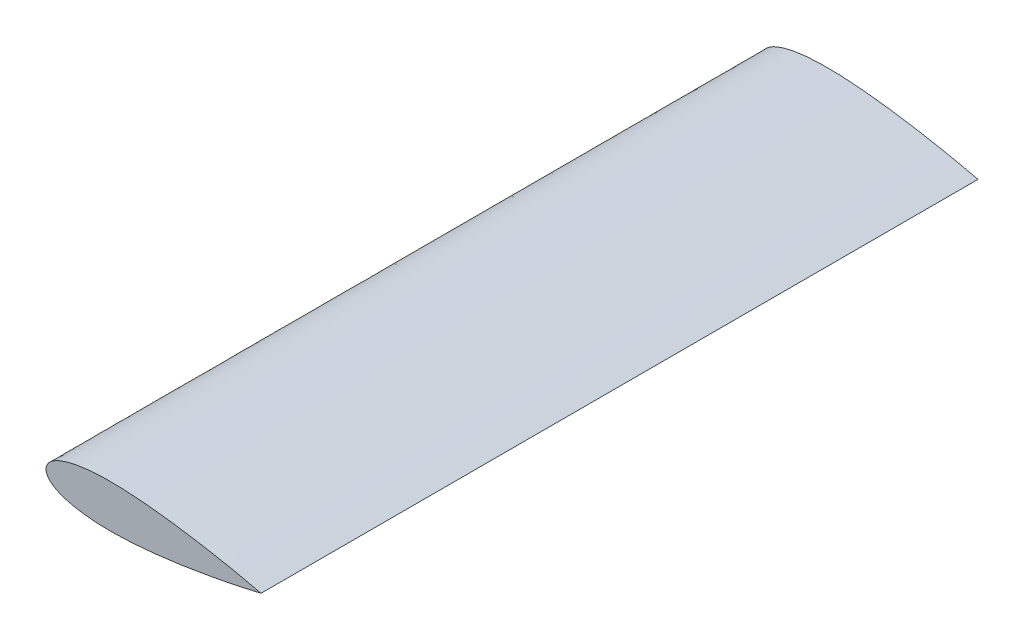
ISO-10303-21;
HEADER;
FILE_DESCRIPTION(('STEP AP214'),'2;1');
FILE_NAME('part.step','',(''),(''),'','','');
FILE_SCHEMA(('AUTOMOTIVE_DESIGN { 1 0 10303 214 1 1 1 1 }'));
ENDSEC;
DATA;
#1=APPLICATION_CONTEXT('core data for automotive mechanical design processes');
#2=APPLICATION_PROTOCOL_DEFINITION('international standard','automotive_design',2000,#1);
#3=PRODUCT_CONTEXT('',#1,'mechanical');
#4=PRODUCT('Part','Part','',(#3));
#5=PRODUCT_RELATED_PRODUCT_CATEGORY('part','',(#4));
#6=PRODUCT_DEFINITION_FORMATION('','',#4);
#7=PRODUCT_DEFINITION_CONTEXT('part definition',#1,'design');
#8=PRODUCT_DEFINITION('design','',#6,#7);
#9=PRODUCT_DEFINITION_SHAPE('','',#8);
#10=(LENGTH_UNIT() NAMED_UNIT(*) SI_UNIT(.MILLI.,.METRE.));
#11=(NAMED_UNIT(*) PLANE_ANGLE_UNIT() SI_UNIT($,.RADIAN.));
#12=(NAMED_UNIT(*) SI_UNIT($,.STERADIAN.) SOLID_ANGLE_UNIT());
#13=UNCERTAINTY_MEASURE_WITH_UNIT(LENGTH_MEASURE(1.E-05),#10,'distance_accuracy_value','');
#14=(GEOMETRIC_REPRESENTATION_CONTEXT(3) GLOBAL_UNCERTAINTY_ASSIGNED_CONTEXT((#13)) GLOBAL_UNIT_ASSIGNED_CONTEXT((#10,
#11,#12)) REPRESENTATION_CONTEXT('',''));
#15=CARTESIAN_POINT('',(0.,0.,0.));
#16=DIRECTION('',(0.,0.,1.));
#17=DIRECTION('',(1.,0.,0.));
#18=AXIS2_PLACEMENT_3D('',#15,#16,#17);
#19=CARTESIAN_POINT('',(0.,0.,1000.));
#20=CARTESIAN_POINT('',(-0.000212290200710549,-0.506970743672854,1000.));
#21=CARTESIAN_POINT('',(0.0448647544289061,-1.3817144126552,1000.));
#22=CARTESIAN_POINT('',(0.226017079419716,-2.65083947509055,1000.));
#23=CARTESIAN_POINT('',(0.688025343513839,-4.29995255231681,1000.));
#24=CARTESIAN_POINT('',(1.33554630451256,-5.87304167521856,1000.));
#25=CARTESIAN_POINT('',(2.26695445030294,-7.54257918905263,1000.));
#26=CARTESIAN_POINT('',(3.57194696369109,-9.34610957166791,1000.));
#27=CARTESIAN_POINT('',(5.39138181461839,-11.3246739377115,1000.));
#28=CARTESIAN_POINT('',(7.95446974302064,-13.539518756678,1000.));
#29=CARTESIAN_POINT('',(11.5849756721098,-16.0215104117936,1000.));
#30=CARTESIAN_POINT('',(16.648123965691,-18.72698856863,1000.));
#31=CARTESIAN_POINT('',(23.7931899992348,-21.6497814350951,1000.));
#32=CARTESIAN_POINT('',(33.085765079101,-24.436937203148,1000.));
#33=CARTESIAN_POINT('',(46.6430589076313,-27.2844937854531,1000.));
#34=CARTESIAN_POINT('',(64.0631993073416,-29.3626934954131,1000.));
#35=CARTESIAN_POINT('',(84.450847036775,-30.2603433349292,1000.));
#36=CARTESIAN_POINT('',(107.414943040989,-29.8599607771145,1000.));
#37=CARTESIAN_POINT('',(130.33255614731,-28.4283461385968,1000.));
#38=CARTESIAN_POINT('',(153.186136376176,-26.2147586581511,1000.));
#39=CARTESIAN_POINT('',(175.970846286984,-23.3916547175012,1000.));
#40=CARTESIAN_POINT('',(195.84859278884,-20.4876288124199,1000.));
#41=CARTESIAN_POINT('',(212.844945693719,-17.7329991027964,1000.));
#42=CARTESIAN_POINT('',(226.980485609454,-15.2709461797826,1000.));
#43=CARTESIAN_POINT('',(238.27131386619,-13.2038783932039,1000.));
#44=CARTESIAN_POINT('',(248.135151077137,-11.3101054619426,1000.));
#45=CARTESIAN_POINT('',(256.577305746962,-9.62548668526438,1000.));
#46=CARTESIAN_POINT('',(263.604664912312,-8.17948367611527,1000.));
#47=CARTESIAN_POINT('',(269.219788458469,-6.99739878560199,1000.));
#48=CARTESIAN_POINT('',(274.130990700374,-5.93944771026712,1000.));
#49=CARTESIAN_POINT('',(278.331979903542,-5.01705217847392,1000.));
#50=CARTESIAN_POINT('',(281.838528118221,-4.2349633064989,1000.));
#51=CARTESIAN_POINT('',(284.62664576173,-3.60611219596437,1000.));
#52=CARTESIAN_POINT('',(287.446648094539,-2.96209322967627,1000.));
#53=CARTESIAN_POINT('',(290.200347561058,-2.3265753772993,1000.));
#54=CARTESIAN_POINT('',(293.076089097235,-1.65380671705687,1000.));
#55=CARTESIAN_POINT('',(295.700233887239,-1.03417219685975,1000.));
#56=CARTESIAN_POINT('',(298.078453527672,-0.464134201665752,1000.));
#57=CARTESIAN_POINT('',(299.365470759246,-0.153714708570495,1000.));
#58=CARTESIAN_POINT('',(299.99999999716,-6.8796431127546E-10,1000.));
#59=B_SPLINE_CURVE_WITH_KNOTS('',4,(#19,#20,#21,#22,#23,#24,#25,#26,#27,#28,#29,#30,#31,#32,#33,
#34,#35,#36,#37,#38,#39,#40,#41,#42,#43,#44,#45,#46,#47,#48,#49,#50,#51,#52,#53,#54,#55,#56,#57,
#58),.UNSPECIFIED.,.F.,.F.,(5,1,1,1,1,1,1,1,1,1,1,1,1,1,1,1,1,1,1,1,1,1,1,1,1,1,1,1,1,1,1,1,1,1,
1,1,5),(0.,0.0058745309773168,0.0101683782394239,0.0148281459801955,0.0198354441070049,
0.0255747363868889,0.0323088782353764,0.0406095113955873,0.0509668935399587,0.064812119060437,
0.0832532478295689,0.10712070534969,0.140429681910489,0.177263566086308,0.243881637309454,
0.310499708067121,0.377117784194043,0.443735860910882,0.510353937013768,0.576972013445222,
0.643590090639978,0.676899129664544,0.710208168689109,0.743517207401255,0.776826246113401,
0.793480765951164,0.810135285788927,0.82678980562669,0.843444325464453,0.851771585290635,
0.860098845116817,0.868426104943,0.876753364769182,0.885080624595364,0.893407884421547,
0.901735144247729,0.910062404073911),.UNSPECIFIED.);
#60=DIRECTION('',(0.,0.,-1.));
#61=VECTOR('',#60,1.);
#62=SURFACE_OF_LINEAR_EXTRUSION('',#59,#61);
#63=CARTESIAN_POINT('',(0.,0.,0.));
#64=CARTESIAN_POINT('',(-0.000212290200710549,-0.506970743672854,0.));
#65=CARTESIAN_POINT('',(0.0448647544289061,-1.3817144126552,0.));
#66=CARTESIAN_POINT('',(0.226017079419716,-2.65083947509055,0.));
#67=CARTESIAN_POINT('',(0.688025343513839,-4.29995255231681,0.));
#68=CARTESIAN_POINT('',(1.33554630451256,-5.87304167521856,0.));
#69=CARTESIAN_POINT('',(2.26695445030294,-7.54257918905263,0.));
#70=CARTESIAN_POINT('',(3.57194696369109,-9.34610957166791,0.));
#71=CARTESIAN_POINT('',(5.39138181461839,-11.3246739377115,0.));
#72=CARTESIAN_POINT('',(7.95446974302064,-13.539518756678,0.));
#73=CARTESIAN_POINT('',(11.5849756721098,-16.0215104117936,0.));
#74=CARTESIAN_POINT('',(16.648123965691,-18.72698856863,0.));
#75=CARTESIAN_POINT('',(23.7931899992348,-21.6497814350951,0.));
#76=CARTESIAN_POINT('',(33.085765079101,-24.436937203148,0.));
#77=CARTESIAN_POINT('',(46.6430589076313,-27.2844937854531,0.));
#78=CARTESIAN_POINT('',(64.0631993073416,-29.3626934954131,0.));
#79=CARTESIAN_POINT('',(84.450847036775,-30.2603433349292,0.));
#80=CARTESIAN_POINT('',(107.414943040989,-29.8599607771145,0.));
#81=CARTESIAN_POINT('',(130.33255614731,-28.4283461385968,0.));
#82=CARTESIAN_POINT('',(153.186136376176,-26.2147586581511,0.));
#83=CARTESIAN_POINT('',(175.970846286984,-23.3916547175012,0.));
#84=CARTESIAN_POINT('',(195.84859278884,-20.4876288124199,0.));
#85=CARTESIAN_POINT('',(212.844945693719,-17.7329991027964,0.));
#86=CARTESIAN_POINT('',(226.980485609454,-15.2709461797826,0.));
#87=CARTESIAN_POINT('',(238.27131386619,-13.2038783932039,0.));
#88=CARTESIAN_POINT('',(248.135151077137,-11.3101054619426,0.));
#89=CARTESIAN_POINT('',(256.577305746962,-9.62548668526438,0.));
#90=CARTESIAN_POINT('',(263.604664912312,-8.17948367611527,0.));
#91=CARTESIAN_POINT('',(269.219788458469,-6.99739878560199,0.));
#92=CARTESIAN_POINT('',(274.130990700374,-5.93944771026712,0.));
#93=CARTESIAN_POINT('',(278.331979903542,-5.01705217847392,0.));
#94=CARTESIAN_POINT('',(281.838528118221,-4.2349633064989,0.));
#95=CARTESIAN_POINT('',(284.62664576173,-3.60611219596437,0.));
#96=CARTESIAN_POINT('',(287.446648094539,-2.96209322967627,0.));
#97=CARTESIAN_POINT('',(290.200347561058,-2.3265753772993,0.));
#98=CARTESIAN_POINT('',(293.076089097235,-1.65380671705687,0.));
#99=CARTESIAN_POINT('',(295.700233887239,-1.03417219685975,0.));
#100=CARTESIAN_POINT('',(298.078453527672,-0.464134201665752,0.));
#101=CARTESIAN_POINT('',(299.365470759246,-0.153714708570495,0.));
#102=CARTESIAN_POINT('',(299.99999999716,-6.8796431127546E-10,0.));
#103=B_SPLINE_CURVE_WITH_KNOTS('',4,(#63,#64,#65,#66,#67,#68,#69,#70,#71,#72,#73,#74,#75,#76,
#77,#78,#79,#80,#81,#82,#83,#84,#85,#86,#87,#88,#89,#90,#91,#92,#93,#94,#95,#96,#97,#98,#99,
#100,#101,#102),.UNSPECIFIED.,.F.,.F.,(5,1,1,1,1,1,1,1,1,1,1,1,1,1,1,1,1,1,1,1,1,1,1,1,1,1,1,1,
1,1,1,1,1,1,1,1,5),(0.,0.0058745309773168,0.0101683782394239,0.0148281459801955,
0.0198354441070049,0.0255747363868889,0.0323088782353764,0.0406095113955873,0.0509668935399587,
0.064812119060437,0.0832532478295689,0.10712070534969,0.140429681910489,0.177263566086308,
0.243881637309454,0.310499708067121,0.377117784194043,0.443735860910882,0.510353937013768,
0.576972013445222,0.643590090639978,0.676899129664544,0.710208168689109,0.743517207401255,
0.776826246113401,0.793480765951164,0.810135285788927,0.82678980562669,0.843444325464453,
0.851771585290635,0.860098845116817,0.868426104943,0.876753364769182,0.885080624595364,
0.893407884421547,0.901735144247729,0.910062404073911),.UNSPECIFIED.);
#104=CARTESIAN_POINT('',(0.,0.,0.));
#105=VERTEX_POINT('',#104);
#106=CARTESIAN_POINT('',(299.999999996993,7.28353602284061E-10,0.));
#107=VERTEX_POINT('',#106);
#108=EDGE_CURVE('E67',#105,#107,#103,.T.);
#109=ORIENTED_EDGE('',*,*,#108,.T.);
#110=DIRECTION('',(0.,0.,-1.));
#111=VECTOR('',#110,1.);
#112=CARTESIAN_POINT('',(299.999999996993,7.28353602284061E-10,1000.));
#113=LINE('',#112,#111);
#114=CARTESIAN_POINT('',(299.999999996993,7.28353602284061E-10,1000.));
#115=VERTEX_POINT('',#114);
#116=EDGE_CURVE('E11',#115,#107,#113,.T.);
#117=ORIENTED_EDGE('',*,*,#116,.F.);
#118=CARTESIAN_POINT('',(0.,0.,1000.));
#119=VERTEX_POINT('',#118);
#120=EDGE_CURVE('E66',#119,#115,#59,.T.);
#121=ORIENTED_EDGE('',*,*,#120,.F.);
#122=DIRECTION('',(0.,0.,-1.));
#123=VECTOR('',#122,1.);
#124=CARTESIAN_POINT('',(0.,0.,1000.));
#125=LINE('',#124,#123);
#126=EDGE_CURVE('E44',#119,#105,#125,.T.);
#127=ORIENTED_EDGE('',*,*,#126,.T.);
#128=EDGE_LOOP('',(#109,#117,#121,#127));
#129=FACE_BOUND('',#128,.T.);
#130=ADVANCED_FACE('F35',(#129),#62,.F.);
#131=CARTESIAN_POINT('',(299.999999996993,7.28353602284061E-10,1000.));
#132=CARTESIAN_POINT('',(299.365470759119,0.153714708601082,1000.));
#133=CARTESIAN_POINT('',(298.078453527568,0.464134201690716,1000.));
#134=CARTESIAN_POINT('',(295.700233887195,1.03417219686993,1000.));
#135=CARTESIAN_POINT('',(293.076089097235,1.65380671705687,1000.));
#136=CARTESIAN_POINT('',(290.200347561058,2.3265753772993,1000.));
#137=CARTESIAN_POINT('',(287.446648094539,2.96209322967627,1000.));
#138=CARTESIAN_POINT('',(284.62664576173,3.60611219596437,1000.));
#139=CARTESIAN_POINT('',(281.838528118221,4.2349633064989,1000.));
#140=CARTESIAN_POINT('',(278.331979903542,5.01705217847392,1000.));
#141=CARTESIAN_POINT('',(274.130990700374,5.93944771026712,1000.));
#142=CARTESIAN_POINT('',(269.219788458469,6.99739878560199,1000.));
#143=CARTESIAN_POINT('',(263.604664912312,8.17948367611527,1000.));
#144=CARTESIAN_POINT('',(256.577305746962,9.62548668526438,1000.));
#145=CARTESIAN_POINT('',(248.135151077137,11.3101054619426,1000.));
#146=CARTESIAN_POINT('',(238.27131386619,13.2038783932039,1000.));
#147=CARTESIAN_POINT('',(226.980485609454,15.2709461797826,1000.));
#148=CARTESIAN_POINT('',(212.844945693719,17.7329991027964,1000.));
#149=CARTESIAN_POINT('',(195.84859278884,20.4876288124199,1000.));
#150=CARTESIAN_POINT('',(175.970846286984,23.3916547175012,1000.));
#151=CARTESIAN_POINT('',(153.186136376176,26.2147586581511,1000.));
#152=CARTESIAN_POINT('',(130.33255614731,28.4283461385968,1000.));
#153=CARTESIAN_POINT('',(107.414943040989,29.8599607771145,1000.));
#154=CARTESIAN_POINT('',(84.450847036775,30.2603433349292,1000.));
#155=CARTESIAN_POINT('',(64.0631993073416,29.3626934954131,1000.));
#156=CARTESIAN_POINT('',(46.6430589076313,27.2844937854531,1000.));
#157=CARTESIAN_POINT('',(33.085765079101,24.436937203148,1000.));
#158=CARTESIAN_POINT('',(23.7931899992348,21.6497814350951,1000.));
#159=CARTESIAN_POINT('',(16.648123965691,18.72698856863,1000.));
#160=CARTESIAN_POINT('',(11.5849756721098,16.0215104117936,1000.));
#161=CARTESIAN_POINT('',(7.95446974302064,13.539518756678,1000.));
#162=CARTESIAN_POINT('',(5.39138181461839,11.3246739377115,1000.));
#163=CARTESIAN_POINT('',(3.57194696369109,9.34610957166791,1000.));
#164=CARTESIAN_POINT('',(2.26695445030294,7.54257918905263,1000.));
#165=CARTESIAN_POINT('',(1.33554630451256,5.87304167521856,1000.));
#166=CARTESIAN_POINT('',(0.688025343513839,4.29995255231681,1000.));
#167=CARTESIAN_POINT('',(0.226017079419716,2.65083947509055,1000.));
#168=CARTESIAN_POINT('',(0.0448647544289061,1.3817144126552,1000.));
#169=CARTESIAN_POINT('',(-0.000212290200710549,0.506970743672854,1000.));
#170=CARTESIAN_POINT('',(0.,0.,1000.));
#171=B_SPLINE_CURVE_WITH_KNOTS('',4,(#131,#132,#133,#134,#135,#136,#137,#138,#139,#140,#141,
#142,#143,#144,#145,#146,#147,#148,#149,#150,#151,#152,#153,#154,#155,#156,#157,#158,#159,#160,
#161,#162,#163,#164,#165,#166,#167,#168,#169,#170),.UNSPECIFIED.,.F.,.F.,(5,1,1,1,1,1,1,1,1,1,1,
1,1,1,1,1,1,1,1,1,1,1,1,1,1,1,1,1,1,1,1,1,1,1,1,1,5),(0.,0.00832725982618221,0.0166545196523645,
0.0249817794785469,0.0333090393047292,0.0416362991309115,0.0499635589570938,0.0582908187832761,
0.0666180786094585,0.0832725984472212,0.099927118284984,0.116581638122747,0.13323615796051,
0.166545196672656,0.199854235384802,0.233163274409367,0.266472313433933,0.333090390628689,
0.399708467060143,0.466326543163029,0.532944619879868,0.59956269600679,0.666180766764457,
0.732798837987603,0.769632722163422,0.80294169872422,0.826809156244342,0.845250285013474,
0.859095510533952,0.869452892678324,0.877753525838535,0.884487667687022,0.890226959966906,
0.895234258093716,0.899894025834487,0.904187873096594,0.910062404073911),.UNSPECIFIED.);
#172=DIRECTION('',(0.,0.,-1.));
#173=VECTOR('',#172,1.);
#174=SURFACE_OF_LINEAR_EXTRUSION('',#171,#173);
#175=CARTESIAN_POINT('',(299.999999996993,7.28353602284061E-10,0.));
#176=CARTESIAN_POINT('',(299.365470759119,0.153714708601082,0.));
#177=CARTESIAN_POINT('',(298.078453527568,0.464134201690716,0.));
#178=CARTESIAN_POINT('',(295.700233887195,1.03417219686993,0.));
#179=CARTESIAN_POINT('',(293.076089097235,1.65380671705687,0.));
#180=CARTESIAN_POINT('',(290.200347561058,2.3265753772993,0.));
#181=CARTESIAN_POINT('',(287.446648094539,2.96209322967627,0.));
#182=CARTESIAN_POINT('',(284.62664576173,3.60611219596437,0.));
#183=CARTESIAN_POINT('',(281.838528118221,4.2349633064989,0.));
#184=CARTESIAN_POINT('',(278.331979903542,5.01705217847392,0.));
#185=CARTESIAN_POINT('',(274.130990700374,5.93944771026712,0.));
#186=CARTESIAN_POINT('',(269.219788458469,6.99739878560199,0.));
#187=CARTESIAN_POINT('',(263.604664912312,8.17948367611527,0.));
#188=CARTESIAN_POINT('',(256.577305746962,9.62548668526438,0.));
#189=CARTESIAN_POINT('',(248.135151077137,11.3101054619426,0.));
#190=CARTESIAN_POINT('',(238.27131386619,13.2038783932039,0.));
#191=CARTESIAN_POINT('',(226.980485609454,15.2709461797826,0.));
#192=CARTESIAN_POINT('',(212.844945693719,17.7329991027964,0.));
#193=CARTESIAN_POINT('',(195.84859278884,20.4876288124199,0.));
#194=CARTESIAN_POINT('',(175.970846286984,23.3916547175012,0.));
#195=CARTESIAN_POINT('',(153.186136376176,26.2147586581511,0.));
#196=CARTESIAN_POINT('',(130.33255614731,28.4283461385968,0.));
#197=CARTESIAN_POINT('',(107.414943040989,29.8599607771145,0.));
#198=CARTESIAN_POINT('',(84.450847036775,30.2603433349292,0.));
#199=CARTESIAN_POINT('',(64.0631993073416,29.3626934954131,0.));
#200=CARTESIAN_POINT('',(46.6430589076313,27.2844937854531,0.));
#201=CARTESIAN_POINT('',(33.085765079101,24.436937203148,0.));
#202=CARTESIAN_POINT('',(23.7931899992348,21.6497814350951,0.));
#203=CARTESIAN_POINT('',(16.648123965691,18.72698856863,0.));
#204=CARTESIAN_POINT('',(11.5849756721098,16.0215104117936,0.));
#205=CARTESIAN_POINT('',(7.95446974302064,13.539518756678,0.));
#206=CARTESIAN_POINT('',(5.39138181461839,11.3246739377115,0.));
#207=CARTESIAN_POINT('',(3.57194696369109,9.34610957166791,0.));
#208=CARTESIAN_POINT('',(2.26695445030294,7.54257918905263,0.));
#209=CARTESIAN_POINT('',(1.33554630451256,5.87304167521856,0.));
#210=CARTESIAN_POINT('',(0.688025343513839,4.29995255231681,0.));
#211=CARTESIAN_POINT('',(0.226017079419716,2.65083947509055,0.));
#212=CARTESIAN_POINT('',(0.0448647544289061,1.3817144126552,0.));
#213=CARTESIAN_POINT('',(-0.000212290200710549,0.506970743672854,0.));
#214=CARTESIAN_POINT('',(0.,0.,0.));
#215=B_SPLINE_CURVE_WITH_KNOTS('',4,(#175,#176,#177,#178,#179,#180,#181,#182,#183,#184,#185,
#186,#187,#188,#189,#190,#191,#192,#193,#194,#195,#196,#197,#198,#199,#200,#201,#202,#203,#204,
#205,#206,#207,#208,#209,#210,#211,#212,#213,#214),.UNSPECIFIED.,.F.,.F.,(5,1,1,1,1,1,1,1,1,1,1,
1,1,1,1,1,1,1,1,1,1,1,1,1,1,1,1,1,1,1,1,1,1,1,1,1,5),(0.,0.00832725982618221,0.0166545196523645,
0.0249817794785469,0.0333090393047292,0.0416362991309115,0.0499635589570938,0.0582908187832761,
0.0666180786094585,0.0832725984472212,0.099927118284984,0.116581638122747,0.13323615796051,
0.166545196672656,0.199854235384802,0.233163274409367,0.266472313433933,0.333090390628689,
0.399708467060143,0.466326543163029,0.532944619879868,0.59956269600679,0.666180766764457,
0.732798837987603,0.769632722163422,0.80294169872422,0.826809156244342,0.845250285013474,
0.859095510533952,0.869452892678324,0.877753525838535,0.884487667687022,0.890226959966906,
0.895234258093716,0.899894025834487,0.904187873096594,0.910062404073911),.UNSPECIFIED.);
#216=EDGE_CURVE('E59',#107,#105,#215,.T.);
#217=ORIENTED_EDGE('',*,*,#216,.T.);
#218=ORIENTED_EDGE('',*,*,#126,.F.);
#219=EDGE_CURVE('E51',#115,#119,#171,.T.);
#220=ORIENTED_EDGE('',*,*,#219,.F.);
#221=ORIENTED_EDGE('',*,*,#116,.T.);
#222=EDGE_LOOP('',(#217,#218,#220,#221));
#223=FACE_BOUND('',#222,.T.);
#224=ADVANCED_FACE('F62',(#223),#174,.F.);
#225=CARTESIAN_POINT('',(145.627622093224,-26.883262456913,1000.));
#226=DIRECTION('',(0.,0.,-1.));
#227=DIRECTION('',(-1.,0.,0.));
#228=AXIS2_PLACEMENT_3D('',#225,#226,#227);
#229=PLANE('',#228);
#230=ORIENTED_EDGE('',*,*,#120,.T.);
#231=ORIENTED_EDGE('',*,*,#219,.T.);
#232=EDGE_LOOP('',(#230,#231));
#233=FACE_BOUND('',#232,.T.);
#234=ADVANCED_FACE('F94',(#233),#229,.F.);
#235=CARTESIAN_POINT('',(145.627622093224,-26.883262456913,0.));
#236=DIRECTION('',(0.,0.,-1.));
#237=DIRECTION('',(-1.,0.,0.));
#238=AXIS2_PLACEMENT_3D('',#235,#236,#237);
#239=PLANE('',#238);
#240=ORIENTED_EDGE('',*,*,#108,.F.);
#241=ORIENTED_EDGE('',*,*,#216,.F.);
#242=EDGE_LOOP('',(#240,#241));
#243=FACE_BOUND('',#242,.T.);
#244=ADVANCED_FACE('F70',(#243),#239,.T.);
#245=CLOSED_SHELL('',(#130,#224,#234,#244));
#246=MANIFOLD_SOLID_BREP('B2',#245);
#247=ADVANCED_BREP_SHAPE_REPRESENTATION('',(#18,#246),#14);
#248=SHAPE_DEFINITION_REPRESENTATION(#9,#247);
ENDSEC;
END-ISO-10303-21;
